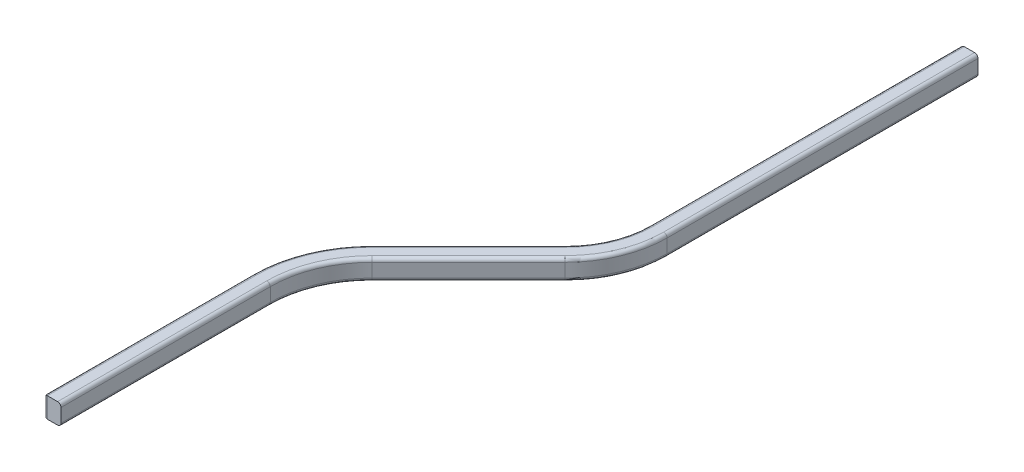
ISO-10303-21;
HEADER;
FILE_DESCRIPTION(('STEP AP214'),'2;1');
FILE_NAME('part.step','',(''),(''),'','','');
FILE_SCHEMA(('AUTOMOTIVE_DESIGN { 1 0 10303 214 1 1 1 1 }'));
ENDSEC;
DATA;
#1=APPLICATION_CONTEXT('core data for automotive mechanical design processes');
#2=APPLICATION_PROTOCOL_DEFINITION('international standard','automotive_design',2000,#1);
#3=PRODUCT_CONTEXT('',#1,'mechanical');
#4=PRODUCT('Part','Part','',(#3));
#5=PRODUCT_RELATED_PRODUCT_CATEGORY('part','',(#4));
#6=PRODUCT_DEFINITION_FORMATION('','',#4);
#7=PRODUCT_DEFINITION_CONTEXT('part definition',#1,'design');
#8=PRODUCT_DEFINITION('design','',#6,#7);
#9=PRODUCT_DEFINITION_SHAPE('','',#8);
#10=(LENGTH_UNIT() NAMED_UNIT(*) SI_UNIT(.MILLI.,.METRE.));
#11=(NAMED_UNIT(*) PLANE_ANGLE_UNIT() SI_UNIT($,.RADIAN.));
#12=(NAMED_UNIT(*) SI_UNIT($,.STERADIAN.) SOLID_ANGLE_UNIT());
#13=UNCERTAINTY_MEASURE_WITH_UNIT(LENGTH_MEASURE(1.E-05),#10,'distance_accuracy_value','');
#14=(GEOMETRIC_REPRESENTATION_CONTEXT(3) GLOBAL_UNCERTAINTY_ASSIGNED_CONTEXT((#13)) GLOBAL_UNIT_ASSIGNED_CONTEXT((#10,
#11,#12)) REPRESENTATION_CONTEXT('',''));
#15=CARTESIAN_POINT('',(0.,0.,0.));
#16=DIRECTION('',(0.,0.,1.));
#17=DIRECTION('',(1.,0.,0.));
#18=AXIS2_PLACEMENT_3D('',#15,#16,#17);
#19=CARTESIAN_POINT('',(34.6249999999996,6.,-121.171505340364));
#20=DIRECTION('',(0.,0.,1.));
#21=DIRECTION('',(1.,0.,0.));
#22=AXIS2_PLACEMENT_3D('',#19,#20,#21);
#23=PLANE('',#22);
#24=DIRECTION('',(-1.,0.,0.));
#25=VECTOR('',#24,1.);
#26=CARTESIAN_POINT('',(34.6249999999996,6.,-121.171505340364));
#27=LINE('',#26,#25);
#28=CARTESIAN_POINT('',(38.6249999999996,6.,-121.171505340364));
#29=VERTEX_POINT('',#28);
#30=CARTESIAN_POINT('',(35.6249999999996,6.,-121.171505340364));
#31=VERTEX_POINT('',#30);
#32=EDGE_CURVE('E222',#29,#31,#27,.T.);
#33=ORIENTED_EDGE('',*,*,#32,.F.);
#34=CARTESIAN_POINT('',(38.6249999999996,5.,-121.171505340364));
#35=DIRECTION('',(0.,0.,1.));
#36=DIRECTION('',(1.,0.,0.));
#37=AXIS2_PLACEMENT_3D('',#34,#35,#36);
#38=CIRCLE('',#37,1.);
#39=CARTESIAN_POINT('',(39.6249999999996,5.,-121.171505340364));
#40=VERTEX_POINT('',#39);
#41=EDGE_CURVE('E205',#29,#40,#38,.F.);
#42=ORIENTED_EDGE('',*,*,#41,.T.);
#43=DIRECTION('',(0.,-1.,0.));
#44=VECTOR('',#43,1.);
#45=CARTESIAN_POINT('',(39.6249999999996,6.,-121.171505340364));
#46=LINE('',#45,#44);
#47=CARTESIAN_POINT('',(39.6249999999996,1.,-121.171505340364));
#48=VERTEX_POINT('',#47);
#49=EDGE_CURVE('E236',#40,#48,#46,.T.);
#50=ORIENTED_EDGE('',*,*,#49,.T.);
#51=CARTESIAN_POINT('',(38.6249999999996,1.,-121.171505340364));
#52=DIRECTION('',(0.,0.,1.));
#53=DIRECTION('',(1.,0.,0.));
#54=AXIS2_PLACEMENT_3D('',#51,#52,#53);
#55=CIRCLE('',#54,1.);
#56=CARTESIAN_POINT('',(38.6249999999996,0.,-121.171505340364));
#57=VERTEX_POINT('',#56);
#58=EDGE_CURVE('E216',#48,#57,#55,.F.);
#59=ORIENTED_EDGE('',*,*,#58,.T.);
#60=DIRECTION('',(-1.,0.,0.));
#61=VECTOR('',#60,1.);
#62=CARTESIAN_POINT('',(34.6249999999996,0.,-121.171505340364));
#63=LINE('',#62,#61);
#64=CARTESIAN_POINT('',(35.6249999999996,0.,-121.171505340364));
#65=VERTEX_POINT('',#64);
#66=EDGE_CURVE('E239',#57,#65,#63,.T.);
#67=ORIENTED_EDGE('',*,*,#66,.T.);
#68=DIRECTION('',(0.,-1.,0.));
#69=VECTOR('',#68,1.);
#70=CARTESIAN_POINT('',(35.6249999999996,6.,-121.171505340364));
#71=LINE('',#70,#69);
#72=EDGE_CURVE('E231',#65,#31,#71,.F.);
#73=ORIENTED_EDGE('',*,*,#72,.T.);
#74=EDGE_LOOP('',(#33,#42,#50,#59,#67,#73));
#75=FACE_BOUND('',#74,.T.);
#76=ADVANCED_FACE('F43',(#75),#23,.F.);
#77=CARTESIAN_POINT('',(34.6249999999999,6.,-29.6402360015568));
#78=DIRECTION('',(1.,0.,0.));
#79=DIRECTION('',(0.,0.,-1.));
#80=AXIS2_PLACEMENT_3D('',#77,#78,#79);
#81=PLANE('',#80);
#82=DIRECTION('',(0.,-1.,0.));
#83=VECTOR('',#82,1.);
#84=CARTESIAN_POINT('',(34.6249999999999,6.,-29.6402360015568));
#85=LINE('',#84,#83);
#86=CARTESIAN_POINT('',(34.6249999999999,5.,-29.6402360015568));
#87=VERTEX_POINT('',#86);
#88=CARTESIAN_POINT('',(34.6249999999999,1.,-29.6402360015568));
#89=VERTEX_POINT('',#88);
#90=EDGE_CURVE('E268',#87,#89,#85,.T.);
#91=ORIENTED_EDGE('',*,*,#90,.F.);
#92=DIRECTION('',(0.,0.,1.));
#93=VECTOR('',#92,1.);
#94=CARTESIAN_POINT('',(34.6249999999999,5.,-29.6402360015568));
#95=LINE('',#94,#93);
#96=CARTESIAN_POINT('',(34.6249999999996,5.,-120.171505340364));
#97=VERTEX_POINT('',#96);
#98=EDGE_CURVE('E291',#87,#97,#95,.F.);
#99=ORIENTED_EDGE('',*,*,#98,.T.);
#100=DIRECTION('',(0.,-1.,0.));
#101=VECTOR('',#100,1.);
#102=CARTESIAN_POINT('',(34.6249999999996,6.,-120.171505340364));
#103=LINE('',#102,#101);
#104=CARTESIAN_POINT('',(34.6249999999996,1.,-120.171505340364));
#105=VERTEX_POINT('',#104);
#106=EDGE_CURVE('E287',#97,#105,#103,.T.);
#107=ORIENTED_EDGE('',*,*,#106,.T.);
#108=DIRECTION('',(0.,0.,1.));
#109=VECTOR('',#108,1.);
#110=CARTESIAN_POINT('',(34.6249999999999,1.,-29.6402360015568));
#111=LINE('',#110,#109);
#112=EDGE_CURVE('E289',#105,#89,#111,.T.);
#113=ORIENTED_EDGE('',*,*,#112,.T.);
#114=EDGE_LOOP('',(#91,#99,#107,#113));
#115=FACE_BOUND('',#114,.T.);
#116=ADVANCED_FACE('F466',(#115),#81,.F.);
#117=CARTESIAN_POINT('',(9.62499999999999,6.,-29.6402360015567));
#118=DIRECTION('',(0.,-1.,0.));
#119=DIRECTION('',(0.,0.,-1.));
#120=AXIS2_PLACEMENT_3D('',#117,#118,#119);
#121=CYLINDRICAL_SURFACE('',#120,24.9999999999999);
#122=DIRECTION('',(0.,-1.,0.));
#123=VECTOR('',#122,1.);
#124=CARTESIAN_POINT('',(27.3026695296636,6.,-11.962566471893));
#125=LINE('',#124,#123);
#126=CARTESIAN_POINT('',(27.3026695296636,5.,-11.962566471893));
#127=VERTEX_POINT('',#126);
#128=CARTESIAN_POINT('',(27.3026695296636,1.,-11.962566471893));
#129=VERTEX_POINT('',#128);
#130=EDGE_CURVE('E265',#127,#129,#125,.T.);
#131=ORIENTED_EDGE('',*,*,#130,.F.);
#132=CARTESIAN_POINT('',(9.62499999999999,5.,-29.6402360015567));
#133=DIRECTION('',(0.,-1.,0.));
#134=DIRECTION('',(0.,0.,-1.));
#135=AXIS2_PLACEMENT_3D('',#132,#133,#134);
#136=CIRCLE('',#135,24.9999999999999);
#137=EDGE_CURVE('E296',#127,#87,#136,.F.);
#138=ORIENTED_EDGE('',*,*,#137,.T.);
#139=ORIENTED_EDGE('',*,*,#90,.T.);
#140=CARTESIAN_POINT('',(9.62499999999999,1.,-29.6402360015567));
#141=DIRECTION('',(0.,-1.,0.));
#142=DIRECTION('',(0.,0.,-1.));
#143=AXIS2_PLACEMENT_3D('',#140,#141,#142);
#144=CIRCLE('',#143,24.9999999999999);
#145=EDGE_CURVE('E294',#89,#129,#144,.T.);
#146=ORIENTED_EDGE('',*,*,#145,.T.);
#147=EDGE_LOOP('',(#131,#138,#139,#146));
#148=FACE_BOUND('',#147,.T.);
#149=ADVANCED_FACE('F471',(#148),#121,.F.);
#150=CARTESIAN_POINT('',(-1.12373734152904,6.,16.4638403992997));
#151=DIRECTION('',(0.707106781186548,0.,0.707106781186547));
#152=DIRECTION('',(0.707106781186547,0.,-0.707106781186548));
#153=AXIS2_PLACEMENT_3D('',#150,#151,#152);
#154=PLANE('',#153);
#155=DIRECTION('',(0.,-1.,0.));
#156=VECTOR('',#155,1.);
#157=CARTESIAN_POINT('',(-1.12373734152904,6.,16.4638403992997));
#158=LINE('',#157,#156);
#159=CARTESIAN_POINT('',(-1.12373734152904,5.,16.4638403992997));
#160=VERTEX_POINT('',#159);
#161=CARTESIAN_POINT('',(-1.12373734152904,1.,16.4638403992997));
#162=VERTEX_POINT('',#161);
#163=EDGE_CURVE('E262',#160,#162,#158,.T.);
#164=ORIENTED_EDGE('',*,*,#163,.F.);
#165=DIRECTION('',(-0.707106781186547,0.,0.707106781186548));
#166=VECTOR('',#165,1.);
#167=CARTESIAN_POINT('',(-1.12373734152904,5.,16.4638403992997));
#168=LINE('',#167,#166);
#169=EDGE_CURVE('E300',#160,#127,#168,.F.);
#170=ORIENTED_EDGE('',*,*,#169,.T.);
#171=ORIENTED_EDGE('',*,*,#130,.T.);
#172=DIRECTION('',(-0.707106781186547,0.,0.707106781186548));
#173=VECTOR('',#172,1.);
#174=CARTESIAN_POINT('',(-1.12373734152904,1.,16.4638403992997));
#175=LINE('',#174,#173);
#176=EDGE_CURVE('E298',#129,#162,#175,.T.);
#177=ORIENTED_EDGE('',*,*,#176,.T.);
#178=EDGE_LOOP('',(#164,#170,#171,#177));
#179=FACE_BOUND('',#178,.T.);
#180=ADVANCED_FACE('F839',(#179),#154,.F.);
#181=CARTESIAN_POINT('',(23.625,6.,41.2125777408289));
#182=DIRECTION('',(0.,-1.,0.));
#183=DIRECTION('',(0.,0.,-1.));
#184=AXIS2_PLACEMENT_3D('',#181,#182,#183);
#185=CYLINDRICAL_SURFACE('',#184,35.);
#186=DIRECTION('',(0.,-1.,0.));
#187=VECTOR('',#186,1.);
#188=CARTESIAN_POINT('',(-11.375,6.,41.212577740829));
#189=LINE('',#188,#187);
#190=CARTESIAN_POINT('',(-11.375,5.,41.212577740829));
#191=VERTEX_POINT('',#190);
#192=CARTESIAN_POINT('',(-11.375,1.,41.212577740829));
#193=VERTEX_POINT('',#192);
#194=EDGE_CURVE('E260',#191,#193,#189,.T.);
#195=ORIENTED_EDGE('',*,*,#194,.F.);
#196=CARTESIAN_POINT('',(23.625,5.,41.2125777408289));
#197=DIRECTION('',(0.,-1.,0.));
#198=DIRECTION('',(0.,0.,-1.));
#199=AXIS2_PLACEMENT_3D('',#196,#197,#198);
#200=CIRCLE('',#199,35.);
#201=EDGE_CURVE('E304',#191,#160,#200,.T.);
#202=ORIENTED_EDGE('',*,*,#201,.T.);
#203=ORIENTED_EDGE('',*,*,#163,.T.);
#204=CARTESIAN_POINT('',(23.625,1.,41.2125777408289));
#205=DIRECTION('',(0.,-1.,0.));
#206=DIRECTION('',(0.,0.,-1.));
#207=AXIS2_PLACEMENT_3D('',#204,#205,#206);
#208=CIRCLE('',#207,35.);
#209=EDGE_CURVE('E302',#162,#193,#208,.F.);
#210=ORIENTED_EDGE('',*,*,#209,.T.);
#211=EDGE_LOOP('',(#195,#202,#203,#210));
#212=FACE_BOUND('',#211,.T.);
#213=ADVANCED_FACE('F439',(#212),#185,.T.);
#214=CARTESIAN_POINT('',(-11.3749999999998,6.,102.828494660829));
#215=DIRECTION('',(1.,0.,0.));
#216=DIRECTION('',(0.,0.,-1.));
#217=AXIS2_PLACEMENT_3D('',#214,#215,#216);
#218=PLANE('',#217);
#219=DIRECTION('',(0.,-1.,0.));
#220=VECTOR('',#219,1.);
#221=CARTESIAN_POINT('',(-11.3749999999998,6.,101.828494660829));
#222=LINE('',#221,#220);
#223=CARTESIAN_POINT('',(-11.3749999999998,1.,101.828494660829));
#224=VERTEX_POINT('',#223);
#225=CARTESIAN_POINT('',(-11.3749999999998,5.,101.828494660829));
#226=VERTEX_POINT('',#225);
#227=EDGE_CURVE('E60',#224,#226,#222,.F.);
#228=ORIENTED_EDGE('',*,*,#227,.T.);
#229=DIRECTION('',(0.,0.,1.));
#230=VECTOR('',#229,1.);
#231=CARTESIAN_POINT('',(-11.3749999999998,5.,102.828494660829));
#232=LINE('',#231,#230);
#233=EDGE_CURVE('E351',#226,#191,#232,.F.);
#234=ORIENTED_EDGE('',*,*,#233,.T.);
#235=ORIENTED_EDGE('',*,*,#194,.T.);
#236=DIRECTION('',(0.,0.,1.));
#237=VECTOR('',#236,1.);
#238=CARTESIAN_POINT('',(-11.3749999999998,1.,102.828494660829));
#239=LINE('',#238,#237);
#240=EDGE_CURVE('E65',#193,#224,#239,.T.);
#241=ORIENTED_EDGE('',*,*,#240,.T.);
#242=EDGE_LOOP('',(#228,#234,#235,#241));
#243=FACE_BOUND('',#242,.T.);
#244=ADVANCED_FACE('F437',(#243),#218,.F.);
#245=CARTESIAN_POINT('',(-6.37499999999976,6.,102.828494660829));
#246=DIRECTION('',(0.,0.,-1.));
#247=DIRECTION('',(-1.,0.,0.));
#248=AXIS2_PLACEMENT_3D('',#245,#246,#247);
#249=PLANE('',#248);
#250=DIRECTION('',(1.,0.,0.));
#251=VECTOR('',#250,1.);
#252=CARTESIAN_POINT('',(-6.37499999999976,6.,102.828494660829));
#253=LINE('',#252,#251);
#254=CARTESIAN_POINT('',(-10.3749999999998,6.,102.828494660829));
#255=VERTEX_POINT('',#254);
#256=CARTESIAN_POINT('',(-7.37499999999976,6.,102.828494660829));
#257=VERTEX_POINT('',#256);
#258=EDGE_CURVE('E232',#255,#257,#253,.T.);
#259=ORIENTED_EDGE('',*,*,#258,.F.);
#260=DIRECTION('',(0.,-1.,0.));
#261=VECTOR('',#260,1.);
#262=CARTESIAN_POINT('',(-10.3749999999998,6.,102.828494660829));
#263=LINE('',#262,#261);
#264=CARTESIAN_POINT('',(-10.3749999999998,0.,102.828494660829));
#265=VERTEX_POINT('',#264);
#266=EDGE_CURVE('E347',#255,#265,#263,.T.);
#267=ORIENTED_EDGE('',*,*,#266,.T.);
#268=DIRECTION('',(1.,0.,0.));
#269=VECTOR('',#268,1.);
#270=CARTESIAN_POINT('',(-6.37499999999976,0.,102.828494660829));
#271=LINE('',#270,#269);
#272=CARTESIAN_POINT('',(-7.37499999999976,0.,102.828494660829));
#273=VERTEX_POINT('',#272);
#274=EDGE_CURVE('E233',#265,#273,#271,.T.);
#275=ORIENTED_EDGE('',*,*,#274,.T.);
#276=CARTESIAN_POINT('',(-7.37499999999976,1.,102.828494660829));
#277=DIRECTION('',(0.,0.,-1.));
#278=DIRECTION('',(-1.,0.,0.));
#279=AXIS2_PLACEMENT_3D('',#276,#277,#278);
#280=CIRCLE('',#279,1.);
#281=CARTESIAN_POINT('',(-6.37499999999976,1.,102.828494660829));
#282=VERTEX_POINT('',#281);
#283=EDGE_CURVE('E343',#273,#282,#280,.F.);
#284=ORIENTED_EDGE('',*,*,#283,.T.);
#285=DIRECTION('',(0.,-1.,0.));
#286=VECTOR('',#285,1.);
#287=CARTESIAN_POINT('',(-6.37499999999976,6.,102.828494660829));
#288=LINE('',#287,#286);
#289=CARTESIAN_POINT('',(-6.37499999999976,5.,102.828494660829));
#290=VERTEX_POINT('',#289);
#291=EDGE_CURVE('E257',#290,#282,#288,.T.);
#292=ORIENTED_EDGE('',*,*,#291,.F.);
#293=CARTESIAN_POINT('',(-7.37499999999976,5.,102.828494660829));
#294=DIRECTION('',(0.,0.,-1.));
#295=DIRECTION('',(-1.,0.,0.));
#296=AXIS2_PLACEMENT_3D('',#293,#294,#295);
#297=CIRCLE('',#296,1.);
#298=EDGE_CURVE('E345',#290,#257,#297,.F.);
#299=ORIENTED_EDGE('',*,*,#298,.T.);
#300=EDGE_LOOP('',(#259,#267,#275,#284,#292,#299));
#301=FACE_BOUND('',#300,.T.);
#302=ADVANCED_FACE('F425',(#301),#249,.F.);
#303=CARTESIAN_POINT('',(-6.37499999999976,6.,102.828494660829));
#304=DIRECTION('',(-1.,0.,0.));
#305=DIRECTION('',(0.,0.,1.));
#306=AXIS2_PLACEMENT_3D('',#303,#304,#305);
#307=PLANE('',#306);
#308=DIRECTION('',(0.,-1.,0.));
#309=VECTOR('',#308,1.);
#310=CARTESIAN_POINT('',(-6.37499999999998,6.,41.212577740829));
#311=LINE('',#310,#309);
#312=CARTESIAN_POINT('',(-6.37499999999998,5.,41.212577740829));
#313=VERTEX_POINT('',#312);
#314=CARTESIAN_POINT('',(-6.37499999999998,1.,41.212577740829));
#315=VERTEX_POINT('',#314);
#316=EDGE_CURVE('E254',#313,#315,#311,.T.);
#317=ORIENTED_EDGE('',*,*,#316,.F.);
#318=DIRECTION('',(0.,0.,-1.));
#319=VECTOR('',#318,1.);
#320=CARTESIAN_POINT('',(-6.37499999999976,5.,102.828494660829));
#321=LINE('',#320,#319);
#322=EDGE_CURVE('E11',#313,#290,#321,.F.);
#323=ORIENTED_EDGE('',*,*,#322,.T.);
#324=ORIENTED_EDGE('',*,*,#291,.T.);
#325=DIRECTION('',(0.,0.,-1.));
#326=VECTOR('',#325,1.);
#327=CARTESIAN_POINT('',(-6.37499999999998,1.,41.212577740829));
#328=LINE('',#327,#326);
#329=EDGE_CURVE('E52',#282,#315,#328,.T.);
#330=ORIENTED_EDGE('',*,*,#329,.T.);
#331=EDGE_LOOP('',(#317,#323,#324,#330));
#332=FACE_BOUND('',#331,.T.);
#333=ADVANCED_FACE('F796',(#332),#307,.F.);
#334=CARTESIAN_POINT('',(23.625,6.,41.2125777408289));
#335=DIRECTION('',(0.,-1.,0.));
#336=DIRECTION('',(0.,0.,-1.));
#337=AXIS2_PLACEMENT_3D('',#334,#335,#336);
#338=CYLINDRICAL_SURFACE('',#337,30.);
#339=DIRECTION('',(0.,-1.,0.));
#340=VECTOR('',#339,1.);
#341=CARTESIAN_POINT('',(2.41179656440367,6.,19.9993743052324));
#342=LINE('',#341,#340);
#343=CARTESIAN_POINT('',(2.41179656440367,5.,19.9993743052324));
#344=VERTEX_POINT('',#343);
#345=CARTESIAN_POINT('',(2.41179656440367,1.,19.9993743052324));
#346=VERTEX_POINT('',#345);
#347=EDGE_CURVE('E251',#344,#346,#342,.T.);
#348=ORIENTED_EDGE('',*,*,#347,.F.);
#349=CARTESIAN_POINT('',(23.625,5.,41.2125777408289));
#350=DIRECTION('',(0.,-1.,0.));
#351=DIRECTION('',(0.,0.,-1.));
#352=AXIS2_PLACEMENT_3D('',#349,#350,#351);
#353=CIRCLE('',#352,30.);
#354=EDGE_CURVE('E341',#344,#313,#353,.F.);
#355=ORIENTED_EDGE('',*,*,#354,.T.);
#356=ORIENTED_EDGE('',*,*,#316,.T.);
#357=CARTESIAN_POINT('',(23.625,1.,41.2125777408289));
#358=DIRECTION('',(0.,-1.,0.));
#359=DIRECTION('',(0.,0.,-1.));
#360=AXIS2_PLACEMENT_3D('',#357,#358,#359);
#361=CIRCLE('',#360,30.);
#362=EDGE_CURVE('E339',#315,#346,#361,.T.);
#363=ORIENTED_EDGE('',*,*,#362,.T.);
#364=EDGE_LOOP('',(#348,#355,#356,#363));
#365=FACE_BOUND('',#364,.T.);
#366=ADVANCED_FACE('F784',(#365),#338,.F.);
#367=CARTESIAN_POINT('',(2.41179656440367,6.,19.9993743052324));
#368=DIRECTION('',(-0.707106781186548,0.,-0.707106781186548));
#369=DIRECTION('',(-0.707106781186548,0.,0.707106781186548));
#370=AXIS2_PLACEMENT_3D('',#367,#368,#369);
#371=PLANE('',#370);
#372=DIRECTION('',(0.,-1.,0.));
#373=VECTOR('',#372,1.);
#374=CARTESIAN_POINT('',(30.8382034355963,6.,-8.42703256596035));
#375=LINE('',#374,#373);
#376=CARTESIAN_POINT('',(30.8382034355963,5.,-8.42703256596035));
#377=VERTEX_POINT('',#376);
#378=CARTESIAN_POINT('',(30.8382034355963,1.,-8.42703256596035));
#379=VERTEX_POINT('',#378);
#380=EDGE_CURVE('E248',#377,#379,#375,.T.);
#381=ORIENTED_EDGE('',*,*,#380,.F.);
#382=DIRECTION('',(0.707106781186548,0.,-0.707106781186548));
#383=VECTOR('',#382,1.);
#384=CARTESIAN_POINT('',(2.41179656440367,5.,19.9993743052324));
#385=LINE('',#384,#383);
#386=EDGE_CURVE('E337',#377,#344,#385,.F.);
#387=ORIENTED_EDGE('',*,*,#386,.T.);
#388=ORIENTED_EDGE('',*,*,#347,.T.);
#389=DIRECTION('',(0.707106781186548,0.,-0.707106781186548));
#390=VECTOR('',#389,1.);
#391=CARTESIAN_POINT('',(30.8382034355964,1.,-8.42703256596031));
#392=LINE('',#391,#390);
#393=EDGE_CURVE('E335',#346,#379,#392,.T.);
#394=ORIENTED_EDGE('',*,*,#393,.T.);
#395=EDGE_LOOP('',(#381,#387,#388,#394));
#396=FACE_BOUND('',#395,.T.);
#397=ADVANCED_FACE('F772',(#396),#371,.F.);
#398=CARTESIAN_POINT('',(9.62500000000004,6.,-29.6402360015568));
#399=DIRECTION('',(0.,-1.,0.));
#400=DIRECTION('',(0.,0.,-1.));
#401=AXIS2_PLACEMENT_3D('',#398,#399,#400);
#402=CYLINDRICAL_SURFACE('',#401,30.);
#403=DIRECTION('',(0.,-1.,0.));
#404=VECTOR('',#403,1.);
#405=CARTESIAN_POINT('',(39.6249999999999,6.,-29.6402360015568));
#406=LINE('',#405,#404);
#407=CARTESIAN_POINT('',(39.6249999999999,5.,-29.6402360015568));
#408=VERTEX_POINT('',#407);
#409=CARTESIAN_POINT('',(39.6249999999999,1.,-29.6402360015568));
#410=VERTEX_POINT('',#409);
#411=EDGE_CURVE('E245',#408,#410,#406,.T.);
#412=ORIENTED_EDGE('',*,*,#411,.F.);
#413=CARTESIAN_POINT('',(9.62500000000004,5.,-29.6402360015568));
#414=DIRECTION('',(0.,-1.,0.));
#415=DIRECTION('',(0.,0.,-1.));
#416=AXIS2_PLACEMENT_3D('',#413,#414,#415);
#417=CIRCLE('',#416,30.);
#418=EDGE_CURVE('E333',#408,#377,#417,.T.);
#419=ORIENTED_EDGE('',*,*,#418,.T.);
#420=ORIENTED_EDGE('',*,*,#380,.T.);
#421=CARTESIAN_POINT('',(9.62500000000004,1.,-29.6402360015568));
#422=DIRECTION('',(0.,-1.,0.));
#423=DIRECTION('',(0.,0.,-1.));
#424=AXIS2_PLACEMENT_3D('',#421,#422,#423);
#425=CIRCLE('',#424,30.);
#426=EDGE_CURVE('E331',#379,#410,#425,.F.);
#427=ORIENTED_EDGE('',*,*,#426,.T.);
#428=EDGE_LOOP('',(#412,#419,#420,#427));
#429=FACE_BOUND('',#428,.T.);
#430=ADVANCED_FACE('F760',(#429),#402,.T.);
#431=CARTESIAN_POINT('',(39.6249999999999,6.,-29.6402360015568));
#432=DIRECTION('',(-1.,0.,0.));
#433=DIRECTION('',(0.,0.,1.));
#434=AXIS2_PLACEMENT_3D('',#431,#432,#433);
#435=PLANE('',#434);
#436=ORIENTED_EDGE('',*,*,#49,.F.);
#437=DIRECTION('',(0.,0.,-1.));
#438=VECTOR('',#437,1.);
#439=CARTESIAN_POINT('',(39.6249999999999,5.,-29.6402360015568));
#440=LINE('',#439,#438);
#441=EDGE_CURVE('E210',#40,#408,#440,.F.);
#442=ORIENTED_EDGE('',*,*,#441,.T.);
#443=ORIENTED_EDGE('',*,*,#411,.T.);
#444=DIRECTION('',(0.,0.,-1.));
#445=VECTOR('',#444,1.);
#446=CARTESIAN_POINT('',(39.6249999999996,1.,-121.171505340364));
#447=LINE('',#446,#445);
#448=EDGE_CURVE('E215',#410,#48,#447,.T.);
#449=ORIENTED_EDGE('',*,*,#448,.T.);
#450=EDGE_LOOP('',(#436,#442,#443,#449));
#451=FACE_BOUND('',#450,.T.);
#452=ADVANCED_FACE('F749',(#451),#435,.F.);
#453=CARTESIAN_POINT('',(9.62500000000004,6.,-29.6402360015568));
#454=DIRECTION('',(0.,-1.,0.));
#455=DIRECTION('',(0.,0.,-1.));
#456=AXIS2_PLACEMENT_3D('',#453,#454,#455);
#457=PLANE('',#456);
#458=ORIENTED_EDGE('',*,*,#32,.T.);
#459=DIRECTION('',(0.,0.,1.));
#460=VECTOR('',#459,1.);
#461=CARTESIAN_POINT('',(35.6249999999999,6.,-29.6402360015569));
#462=LINE('',#461,#460);
#463=CARTESIAN_POINT('',(35.6249999999999,6.,-29.6402360015568));
#464=VERTEX_POINT('',#463);
#465=EDGE_CURVE('E285',#31,#464,#462,.T.);
#466=ORIENTED_EDGE('',*,*,#465,.T.);
#467=CARTESIAN_POINT('',(9.62499999999999,6.,-29.6402360015567));
#468=DIRECTION('',(0.,-1.,0.));
#469=DIRECTION('',(0.,0.,-1.));
#470=AXIS2_PLACEMENT_3D('',#467,#468,#469);
#471=CIRCLE('',#470,25.9999999999999);
#472=CARTESIAN_POINT('',(28.0097763108502,6.,-11.2554596907065));
#473=VERTEX_POINT('',#472);
#474=EDGE_CURVE('E283',#464,#473,#471,.T.);
#475=ORIENTED_EDGE('',*,*,#474,.T.);
#476=DIRECTION('',(-0.707106781186547,0.,0.707106781186548));
#477=VECTOR('',#476,1.);
#478=CARTESIAN_POINT('',(28.0097763108503,6.,-11.2554596907066));
#479=LINE('',#478,#477);
#480=CARTESIAN_POINT('',(-0.416630560342491,6.,17.1709471804862));
#481=VERTEX_POINT('',#480);
#482=EDGE_CURVE('E281',#473,#481,#479,.T.);
#483=ORIENTED_EDGE('',*,*,#482,.T.);
#484=CARTESIAN_POINT('',(23.625,6.,41.2125777408289));
#485=DIRECTION('',(0.,-1.,0.));
#486=DIRECTION('',(0.,0.,-1.));
#487=AXIS2_PLACEMENT_3D('',#484,#485,#486);
#488=CIRCLE('',#487,34.);
#489=CARTESIAN_POINT('',(-10.375,6.,41.212577740829));
#490=VERTEX_POINT('',#489);
#491=EDGE_CURVE('E279',#481,#490,#488,.F.);
#492=ORIENTED_EDGE('',*,*,#491,.T.);
#493=DIRECTION('',(0.,0.,1.));
#494=VECTOR('',#493,1.);
#495=CARTESIAN_POINT('',(-10.3750000000002,6.,-29.6402360015567));
#496=LINE('',#495,#494);
#497=EDGE_CURVE('E227',#490,#255,#496,.T.);
#498=ORIENTED_EDGE('',*,*,#497,.T.);
#499=ORIENTED_EDGE('',*,*,#258,.T.);
#500=DIRECTION('',(0.,0.,-1.));
#501=VECTOR('',#500,1.);
#502=CARTESIAN_POINT('',(-7.37500000000025,6.,-29.6402360015568));
#503=LINE('',#502,#501);
#504=CARTESIAN_POINT('',(-7.37499999999998,6.,41.212577740829));
#505=VERTEX_POINT('',#504);
#506=EDGE_CURVE('E271',#257,#505,#503,.T.);
#507=ORIENTED_EDGE('',*,*,#506,.T.);
#508=CARTESIAN_POINT('',(23.625,6.,41.2125777408289));
#509=DIRECTION('',(0.,-1.,0.));
#510=DIRECTION('',(0.,0.,-1.));
#511=AXIS2_PLACEMENT_3D('',#508,#509,#510);
#512=CIRCLE('',#511,31.);
#513=CARTESIAN_POINT('',(1.70468978321712,6.,19.2922675240459));
#514=VERTEX_POINT('',#513);
#515=EDGE_CURVE('E273',#505,#514,#512,.T.);
#516=ORIENTED_EDGE('',*,*,#515,.T.);
#517=DIRECTION('',(0.707106781186548,0.,-0.707106781186548));
#518=VECTOR('',#517,1.);
#519=CARTESIAN_POINT('',(30.1310966544099,6.,-9.13413934714694));
#520=LINE('',#519,#518);
#521=CARTESIAN_POINT('',(30.1310966544098,6.,-9.13413934714686));
#522=VERTEX_POINT('',#521);
#523=EDGE_CURVE('E275',#514,#522,#520,.T.);
#524=ORIENTED_EDGE('',*,*,#523,.T.);
#525=CARTESIAN_POINT('',(9.62500000000004,6.,-29.6402360015568));
#526=DIRECTION('',(0.,-1.,0.));
#527=DIRECTION('',(0.,0.,-1.));
#528=AXIS2_PLACEMENT_3D('',#525,#526,#527);
#529=CIRCLE('',#528,29.);
#530=CARTESIAN_POINT('',(38.625,6.,-29.6402360015568));
#531=VERTEX_POINT('',#530);
#532=EDGE_CURVE('E225',#522,#531,#529,.F.);
#533=ORIENTED_EDGE('',*,*,#532,.T.);
#534=DIRECTION('',(0.,0.,-1.));
#535=VECTOR('',#534,1.);
#536=CARTESIAN_POINT('',(38.6249999999999,6.,-29.6402360015569));
#537=LINE('',#536,#535);
#538=EDGE_CURVE('E209',#531,#29,#537,.T.);
#539=ORIENTED_EDGE('',*,*,#538,.T.);
#540=EDGE_LOOP('',(#458,#466,#475,#483,#492,#498,#499,#507,#516,#524,#533,#539));
#541=FACE_BOUND('',#540,.T.);
#542=ADVANCED_FACE('F220',(#541),#457,.F.);
#543=CARTESIAN_POINT('',(9.62500000000004,0.,-29.6402360015568));
#544=DIRECTION('',(0.,-1.,0.));
#545=DIRECTION('',(0.,0.,-1.));
#546=AXIS2_PLACEMENT_3D('',#543,#544,#545);
#547=PLANE('',#546);
#548=CARTESIAN_POINT('',(9.62499999999999,0.,-29.6402360015567));
#549=DIRECTION('',(0.,-1.,0.));
#550=DIRECTION('',(0.,0.,-1.));
#551=AXIS2_PLACEMENT_3D('',#548,#549,#550);
#552=CIRCLE('',#551,25.9999999999999);
#553=CARTESIAN_POINT('',(28.0097763108502,0.,-11.2554596907065));
#554=VERTEX_POINT('',#553);
#555=CARTESIAN_POINT('',(35.6249999999999,0.,-29.6402360015568));
#556=VERTEX_POINT('',#555);
#557=EDGE_CURVE('E322',#554,#556,#552,.F.);
#558=ORIENTED_EDGE('',*,*,#557,.T.);
#559=DIRECTION('',(0.,0.,1.));
#560=VECTOR('',#559,1.);
#561=CARTESIAN_POINT('',(35.6249999999996,0.,-121.171505340364));
#562=LINE('',#561,#560);
#563=EDGE_CURVE('E324',#556,#65,#562,.F.);
#564=ORIENTED_EDGE('',*,*,#563,.T.);
#565=ORIENTED_EDGE('',*,*,#66,.F.);
#566=DIRECTION('',(0.,0.,-1.));
#567=VECTOR('',#566,1.);
#568=CARTESIAN_POINT('',(38.6249999999999,0.,-29.6402360015568));
#569=LINE('',#568,#567);
#570=CARTESIAN_POINT('',(38.625,0.,-29.6402360015568));
#571=VERTEX_POINT('',#570);
#572=EDGE_CURVE('E314',#57,#571,#569,.F.);
#573=ORIENTED_EDGE('',*,*,#572,.T.);
#574=CARTESIAN_POINT('',(9.62500000000004,0.,-29.6402360015568));
#575=DIRECTION('',(0.,-1.,0.));
#576=DIRECTION('',(0.,0.,-1.));
#577=AXIS2_PLACEMENT_3D('',#574,#575,#576);
#578=CIRCLE('',#577,29.);
#579=CARTESIAN_POINT('',(30.1310966544098,0.,-9.13413934714685));
#580=VERTEX_POINT('',#579);
#581=EDGE_CURVE('E312',#571,#580,#578,.T.);
#582=ORIENTED_EDGE('',*,*,#581,.T.);
#583=DIRECTION('',(0.707106781186548,0.,-0.707106781186548));
#584=VECTOR('',#583,1.);
#585=CARTESIAN_POINT('',(1.70468978321712,0.,19.2922675240459));
#586=LINE('',#585,#584);
#587=CARTESIAN_POINT('',(1.70468978321712,0.,19.2922675240459));
#588=VERTEX_POINT('',#587);
#589=EDGE_CURVE('E310',#580,#588,#586,.F.);
#590=ORIENTED_EDGE('',*,*,#589,.T.);
#591=CARTESIAN_POINT('',(23.625,0.,41.2125777408289));
#592=DIRECTION('',(0.,-1.,0.));
#593=DIRECTION('',(0.,0.,-1.));
#594=AXIS2_PLACEMENT_3D('',#591,#592,#593);
#595=CIRCLE('',#594,31.);
#596=CARTESIAN_POINT('',(-7.37499999999998,0.,41.212577740829));
#597=VERTEX_POINT('',#596);
#598=EDGE_CURVE('E308',#588,#597,#595,.F.);
#599=ORIENTED_EDGE('',*,*,#598,.T.);
#600=DIRECTION('',(0.,0.,-1.));
#601=VECTOR('',#600,1.);
#602=CARTESIAN_POINT('',(-7.37499999999976,0.,102.828494660829));
#603=LINE('',#602,#601);
#604=EDGE_CURVE('E306',#597,#273,#603,.F.);
#605=ORIENTED_EDGE('',*,*,#604,.T.);
#606=ORIENTED_EDGE('',*,*,#274,.F.);
#607=DIRECTION('',(0.,0.,1.));
#608=VECTOR('',#607,1.);
#609=CARTESIAN_POINT('',(-10.375,0.,41.212577740829));
#610=LINE('',#609,#608);
#611=CARTESIAN_POINT('',(-10.375,0.,41.212577740829));
#612=VERTEX_POINT('',#611);
#613=EDGE_CURVE('E316',#265,#612,#610,.F.);
#614=ORIENTED_EDGE('',*,*,#613,.T.);
#615=CARTESIAN_POINT('',(23.625,0.,41.2125777408289));
#616=DIRECTION('',(0.,-1.,0.));
#617=DIRECTION('',(0.,0.,-1.));
#618=AXIS2_PLACEMENT_3D('',#615,#616,#617);
#619=CIRCLE('',#618,34.);
#620=CARTESIAN_POINT('',(-0.416630560342493,0.,17.1709471804862));
#621=VERTEX_POINT('',#620);
#622=EDGE_CURVE('E318',#612,#621,#619,.T.);
#623=ORIENTED_EDGE('',*,*,#622,.T.);
#624=DIRECTION('',(-0.707106781186547,0.,0.707106781186548));
#625=VECTOR('',#624,1.);
#626=CARTESIAN_POINT('',(28.0097763108502,0.,-11.2554596907065));
#627=LINE('',#626,#625);
#628=EDGE_CURVE('E320',#621,#554,#627,.F.);
#629=ORIENTED_EDGE('',*,*,#628,.T.);
#630=EDGE_LOOP('',(#558,#564,#565,#573,#582,#590,#599,#605,#606,#614,#623,#629));
#631=FACE_BOUND('',#630,.T.);
#632=ADVANCED_FACE('F421',(#631),#547,.T.);
#633=CARTESIAN_POINT('',(-10.3749999999998,1.,102.828494660829));
#634=DIRECTION('',(0.,0.,-1.));
#635=DIRECTION('',(-1.,0.,0.));
#636=AXIS2_PLACEMENT_3D('',#633,#634,#635);
#637=CYLINDRICAL_SURFACE('',#636,1.);
#638=CARTESIAN_POINT('',(-10.3749999999998,1.,101.828494660829));
#639=DIRECTION('',(0.,-0.707106781186547,-0.707106781186547));
#640=DIRECTION('',(0.,0.707106781186547,-0.707106781186547));
#641=AXIS2_PLACEMENT_3D('',#638,#639,#640);
#642=ELLIPSE('',#641,1.41421356237309,1.);
#643=EDGE_CURVE('E383',#224,#265,#642,.F.);
#644=ORIENTED_EDGE('',*,*,#643,.F.);
#645=ORIENTED_EDGE('',*,*,#240,.F.);
#646=CARTESIAN_POINT('',(-10.375,1.,41.212577740829));
#647=DIRECTION('',(0.,0.,-1.));
#648=DIRECTION('',(-1.,0.,0.));
#649=AXIS2_PLACEMENT_3D('',#646,#647,#648);
#650=CIRCLE('',#649,1.);
#651=EDGE_CURVE('E242',#612,#193,#650,.T.);
#652=ORIENTED_EDGE('',*,*,#651,.F.);
#653=ORIENTED_EDGE('',*,*,#613,.F.);
#654=EDGE_LOOP('',(#644,#645,#652,#653));
#655=FACE_BOUND('',#654,.T.);
#656=ADVANCED_FACE('F455',(#655),#637,.T.);
#657=CARTESIAN_POINT('',(23.625,1.,41.2125777408289));
#658=DIRECTION('',(0.,-1.,0.));
#659=DIRECTION('',(0.,0.,-1.));
#660=AXIS2_PLACEMENT_3D('',#657,#658,#659);
#661=TOROIDAL_SURFACE('',#660,34.,1.);
#662=ORIENTED_EDGE('',*,*,#651,.T.);
#663=ORIENTED_EDGE('',*,*,#209,.F.);
#664=CARTESIAN_POINT('',(-0.416630560342493,1.,17.1709471804862));
#665=DIRECTION('',(0.707106781186548,0.,-0.707106781186547));
#666=DIRECTION('',(-0.707106781186547,0.,-0.707106781186548));
#667=AXIS2_PLACEMENT_3D('',#664,#665,#666);
#668=CIRCLE('',#667,1.);
#669=EDGE_CURVE('E380',#621,#162,#668,.T.);
#670=ORIENTED_EDGE('',*,*,#669,.F.);
#671=ORIENTED_EDGE('',*,*,#622,.F.);
#672=EDGE_LOOP('',(#662,#663,#670,#671));
#673=FACE_BOUND('',#672,.T.);
#674=ADVANCED_FACE('F444',(#673),#661,.T.);
#675=CARTESIAN_POINT('',(-10.3749999999998,6.,101.828494660829));
#676=DIRECTION('',(0.,-1.,0.));
#677=DIRECTION('',(0.,0.,-1.));
#678=AXIS2_PLACEMENT_3D('',#675,#676,#677);
#679=CYLINDRICAL_SURFACE('',#678,1.);
#680=ORIENTED_EDGE('',*,*,#643,.T.);
#681=ORIENTED_EDGE('',*,*,#266,.F.);
#682=CARTESIAN_POINT('',(-10.3749999999998,5.,101.828494660829));
#683=DIRECTION('',(0.,-0.707106781186547,0.707106781186547));
#684=DIRECTION('',(0.,0.707106781186547,0.707106781186547));
#685=AXIS2_PLACEMENT_3D('',#682,#683,#684);
#686=ELLIPSE('',#685,1.41421356237309,1.);
#687=EDGE_CURVE('E377',#226,#255,#686,.F.);
#688=ORIENTED_EDGE('',*,*,#687,.F.);
#689=ORIENTED_EDGE('',*,*,#227,.F.);
#690=EDGE_LOOP('',(#680,#681,#688,#689));
#691=FACE_BOUND('',#690,.T.);
#692=ADVANCED_FACE('F429',(#691),#679,.T.);
#693=CARTESIAN_POINT('',(-0.416630560342497,1.,17.1709471804862));
#694=DIRECTION('',(0.707106781186547,0.,-0.707106781186548));
#695=DIRECTION('',(-0.707106781186548,0.,-0.707106781186547));
#696=AXIS2_PLACEMENT_3D('',#693,#694,#695);
#697=CYLINDRICAL_SURFACE('',#696,1.);
#698=ORIENTED_EDGE('',*,*,#669,.T.);
#699=ORIENTED_EDGE('',*,*,#176,.F.);
#700=CARTESIAN_POINT('',(28.0097763108502,1.,-11.2554596907065));
#701=DIRECTION('',(0.707106781186546,0.,-0.707106781186549));
#702=DIRECTION('',(-0.707106781186549,0.,-0.707106781186546));
#703=AXIS2_PLACEMENT_3D('',#700,#701,#702);
#704=CIRCLE('',#703,1.);
#705=EDGE_CURVE('E374',#554,#129,#704,.T.);
#706=ORIENTED_EDGE('',*,*,#705,.F.);
#707=ORIENTED_EDGE('',*,*,#628,.F.);
#708=EDGE_LOOP('',(#698,#699,#706,#707));
#709=FACE_BOUND('',#708,.T.);
#710=ADVANCED_FACE('F450',(#709),#697,.T.);
#711=CARTESIAN_POINT('',(-10.3750000000002,5.,-29.6402360015567));
#712=DIRECTION('',(0.,0.,1.));
#713=DIRECTION('',(1.,0.,0.));
#714=AXIS2_PLACEMENT_3D('',#711,#712,#713);
#715=CYLINDRICAL_SURFACE('',#714,1.);
#716=ORIENTED_EDGE('',*,*,#687,.T.);
#717=ORIENTED_EDGE('',*,*,#497,.F.);
#718=CARTESIAN_POINT('',(-10.375,5.,41.212577740829));
#719=DIRECTION('',(0.,0.,-1.));
#720=DIRECTION('',(-1.,0.,0.));
#721=AXIS2_PLACEMENT_3D('',#718,#719,#720);
#722=CIRCLE('',#721,1.);
#723=EDGE_CURVE('E371',#191,#490,#722,.T.);
#724=ORIENTED_EDGE('',*,*,#723,.F.);
#725=ORIENTED_EDGE('',*,*,#233,.F.);
#726=EDGE_LOOP('',(#716,#717,#724,#725));
#727=FACE_BOUND('',#726,.T.);
#728=ADVANCED_FACE('F433',(#727),#715,.T.);
#729=CARTESIAN_POINT('',(9.62499999999999,1.,-29.6402360015567));
#730=DIRECTION('',(0.,-1.,0.));
#731=DIRECTION('',(0.,0.,-1.));
#732=AXIS2_PLACEMENT_3D('',#729,#730,#731);
#733=TOROIDAL_SURFACE('',#732,25.9999999999999,1.);
#734=ORIENTED_EDGE('',*,*,#705,.T.);
#735=ORIENTED_EDGE('',*,*,#145,.F.);
#736=CARTESIAN_POINT('',(35.6249999999999,1.,-29.6402360015568));
#737=DIRECTION('',(0.,0.,-1.));
#738=DIRECTION('',(-1.,0.,0.));
#739=AXIS2_PLACEMENT_3D('',#736,#737,#738);
#740=CIRCLE('',#739,1.);
#741=EDGE_CURVE('E368',#556,#89,#740,.T.);
#742=ORIENTED_EDGE('',*,*,#741,.F.);
#743=ORIENTED_EDGE('',*,*,#557,.F.);
#744=EDGE_LOOP('',(#734,#735,#742,#743));
#745=FACE_BOUND('',#744,.T.);
#746=ADVANCED_FACE('F500',(#745),#733,.T.);
#747=CARTESIAN_POINT('',(23.625,5.,41.2125777408289));
#748=DIRECTION('',(0.,-1.,0.));
#749=DIRECTION('',(0.,0.,-1.));
#750=AXIS2_PLACEMENT_3D('',#747,#748,#749);
#751=TOROIDAL_SURFACE('',#750,34.,1.);
#752=ORIENTED_EDGE('',*,*,#723,.T.);
#753=ORIENTED_EDGE('',*,*,#491,.F.);
#754=CARTESIAN_POINT('',(-0.416630560342496,5.,17.1709471804862));
#755=DIRECTION('',(0.707106781186551,0.,-0.707106781186544));
#756=DIRECTION('',(-0.707106781186544,0.,-0.707106781186551));
#757=AXIS2_PLACEMENT_3D('',#754,#755,#756);
#758=CIRCLE('',#757,1.);
#759=EDGE_CURVE('E365',#160,#481,#758,.T.);
#760=ORIENTED_EDGE('',*,*,#759,.F.);
#761=ORIENTED_EDGE('',*,*,#201,.F.);
#762=EDGE_LOOP('',(#752,#753,#760,#761));
#763=FACE_BOUND('',#762,.T.);
#764=ADVANCED_FACE('F496',(#763),#751,.T.);
#765=CARTESIAN_POINT('',(35.6249999999999,1.,-29.6402360015568));
#766=DIRECTION('',(0.,0.,-1.));
#767=DIRECTION('',(-1.,0.,0.));
#768=AXIS2_PLACEMENT_3D('',#765,#766,#767);
#769=CYLINDRICAL_SURFACE('',#768,1.);
#770=ORIENTED_EDGE('',*,*,#741,.T.);
#771=ORIENTED_EDGE('',*,*,#112,.F.);
#772=CARTESIAN_POINT('',(35.6249999999996,1.,-120.171505340364));
#773=DIRECTION('',(0.,-0.707106781186547,0.707106781186547));
#774=DIRECTION('',(0.,-0.707106781186547,-0.707106781186547));
#775=AXIS2_PLACEMENT_3D('',#772,#773,#774);
#776=ELLIPSE('',#775,1.41421356237309,1.);
#777=EDGE_CURVE('E362',#65,#105,#776,.F.);
#778=ORIENTED_EDGE('',*,*,#777,.F.);
#779=ORIENTED_EDGE('',*,*,#563,.F.);
#780=EDGE_LOOP('',(#770,#771,#778,#779));
#781=FACE_BOUND('',#780,.T.);
#782=ADVANCED_FACE('F492',(#781),#769,.T.);
#783=CARTESIAN_POINT('',(28.0097763108503,5.,-11.2554596907066));
#784=DIRECTION('',(-0.707106781186547,0.,0.707106781186548));
#785=DIRECTION('',(0.707106781186548,0.,0.707106781186547));
#786=AXIS2_PLACEMENT_3D('',#783,#784,#785);
#787=CYLINDRICAL_SURFACE('',#786,1.);
#788=ORIENTED_EDGE('',*,*,#759,.T.);
#789=ORIENTED_EDGE('',*,*,#482,.F.);
#790=CARTESIAN_POINT('',(28.0097763108502,5.,-11.2554596907065));
#791=DIRECTION('',(0.707106781186547,0.,-0.707106781186548));
#792=DIRECTION('',(-0.707106781186548,0.,-0.707106781186547));
#793=AXIS2_PLACEMENT_3D('',#790,#791,#792);
#794=CIRCLE('',#793,1.);
#795=EDGE_CURVE('E359',#127,#473,#794,.T.);
#796=ORIENTED_EDGE('',*,*,#795,.F.);
#797=ORIENTED_EDGE('',*,*,#169,.F.);
#798=EDGE_LOOP('',(#788,#789,#796,#797));
#799=FACE_BOUND('',#798,.T.);
#800=ADVANCED_FACE('F488',(#799),#787,.T.);
#801=CARTESIAN_POINT('',(35.6249999999996,6.,-120.171505340364));
#802=DIRECTION('',(0.,-1.,0.));
#803=DIRECTION('',(0.,0.,-1.));
#804=AXIS2_PLACEMENT_3D('',#801,#802,#803);
#805=CYLINDRICAL_SURFACE('',#804,1.);
#806=ORIENTED_EDGE('',*,*,#777,.T.);
#807=ORIENTED_EDGE('',*,*,#106,.F.);
#808=CARTESIAN_POINT('',(35.6249999999996,5.,-120.171505340364));
#809=DIRECTION('',(0.,-0.707106781186547,-0.707106781186547));
#810=DIRECTION('',(0.,-0.707106781186547,0.707106781186547));
#811=AXIS2_PLACEMENT_3D('',#808,#809,#810);
#812=ELLIPSE('',#811,1.41421356237309,1.);
#813=EDGE_CURVE('E356',#31,#97,#812,.F.);
#814=ORIENTED_EDGE('',*,*,#813,.F.);
#815=ORIENTED_EDGE('',*,*,#72,.F.);
#816=EDGE_LOOP('',(#806,#807,#814,#815));
#817=FACE_BOUND('',#816,.T.);
#818=ADVANCED_FACE('F484',(#817),#805,.T.);
#819=CARTESIAN_POINT('',(9.62499999999999,5.,-29.6402360015567));
#820=DIRECTION('',(0.,-1.,0.));
#821=DIRECTION('',(0.,0.,-1.));
#822=AXIS2_PLACEMENT_3D('',#819,#820,#821);
#823=TOROIDAL_SURFACE('',#822,25.9999999999999,1.);
#824=ORIENTED_EDGE('',*,*,#795,.T.);
#825=ORIENTED_EDGE('',*,*,#474,.F.);
#826=CARTESIAN_POINT('',(35.6249999999999,5.,-29.6402360015568));
#827=DIRECTION('',(0.,0.,-1.));
#828=DIRECTION('',(-1.,0.,0.));
#829=AXIS2_PLACEMENT_3D('',#826,#827,#828);
#830=CIRCLE('',#829,1.);
#831=EDGE_CURVE('E354',#87,#464,#830,.T.);
#832=ORIENTED_EDGE('',*,*,#831,.F.);
#833=ORIENTED_EDGE('',*,*,#137,.F.);
#834=EDGE_LOOP('',(#824,#825,#832,#833));
#835=FACE_BOUND('',#834,.T.);
#836=ADVANCED_FACE('F480',(#835),#823,.T.);
#837=CARTESIAN_POINT('',(35.6249999999999,5.,-29.6402360015569));
#838=DIRECTION('',(0.,0.,1.));
#839=DIRECTION('',(1.,0.,0.));
#840=AXIS2_PLACEMENT_3D('',#837,#838,#839);
#841=CYLINDRICAL_SURFACE('',#840,1.);
#842=ORIENTED_EDGE('',*,*,#813,.T.);
#843=ORIENTED_EDGE('',*,*,#98,.F.);
#844=ORIENTED_EDGE('',*,*,#831,.T.);
#845=ORIENTED_EDGE('',*,*,#465,.F.);
#846=EDGE_LOOP('',(#842,#843,#844,#845));
#847=FACE_BOUND('',#846,.T.);
#848=ADVANCED_FACE('F476',(#847),#841,.T.);
#849=CARTESIAN_POINT('',(-7.37500000000025,5.,-29.6402360015568));
#850=DIRECTION('',(0.,0.,-1.));
#851=DIRECTION('',(-1.,0.,0.));
#852=AXIS2_PLACEMENT_3D('',#849,#850,#851);
#853=CYLINDRICAL_SURFACE('',#852,1.);
#854=ORIENTED_EDGE('',*,*,#298,.F.);
#855=ORIENTED_EDGE('',*,*,#322,.F.);
#856=CARTESIAN_POINT('',(-7.37499999999998,5.,41.212577740829));
#857=DIRECTION('',(0.,0.,-1.));
#858=DIRECTION('',(-1.,0.,0.));
#859=AXIS2_PLACEMENT_3D('',#856,#857,#858);
#860=CIRCLE('',#859,1.);
#861=EDGE_CURVE('E357',#505,#313,#860,.T.);
#862=ORIENTED_EDGE('',*,*,#861,.F.);
#863=ORIENTED_EDGE('',*,*,#506,.F.);
#864=EDGE_LOOP('',(#854,#855,#862,#863));
#865=FACE_BOUND('',#864,.T.);
#866=ADVANCED_FACE('F479',(#865),#853,.T.);
#867=CARTESIAN_POINT('',(23.625,5.,41.2125777408289));
#868=DIRECTION('',(0.,-1.,0.));
#869=DIRECTION('',(0.,0.,-1.));
#870=AXIS2_PLACEMENT_3D('',#867,#868,#869);
#871=TOROIDAL_SURFACE('',#870,31.,1.);
#872=ORIENTED_EDGE('',*,*,#861,.T.);
#873=ORIENTED_EDGE('',*,*,#354,.F.);
#874=CARTESIAN_POINT('',(1.70468978321712,5.,19.2922675240459));
#875=DIRECTION('',(0.707106781186548,0.,-0.707106781186547));
#876=DIRECTION('',(-0.707106781186547,0.,-0.707106781186548));
#877=AXIS2_PLACEMENT_3D('',#874,#875,#876);
#878=CIRCLE('',#877,1.);
#879=EDGE_CURVE('E393',#514,#344,#878,.T.);
#880=ORIENTED_EDGE('',*,*,#879,.F.);
#881=ORIENTED_EDGE('',*,*,#515,.F.);
#882=EDGE_LOOP('',(#872,#873,#880,#881));
#883=FACE_BOUND('',#882,.T.);
#884=ADVANCED_FACE('F556',(#883),#871,.T.);
#885=CARTESIAN_POINT('',(30.1310966544099,5.,-9.13413934714694));
#886=DIRECTION('',(0.707106781186548,0.,-0.707106781186548));
#887=DIRECTION('',(-0.707106781186548,0.,-0.707106781186548));
#888=AXIS2_PLACEMENT_3D('',#885,#886,#887);
#889=CYLINDRICAL_SURFACE('',#888,1.);
#890=ORIENTED_EDGE('',*,*,#879,.T.);
#891=ORIENTED_EDGE('',*,*,#386,.F.);
#892=CARTESIAN_POINT('',(30.1310966544098,5.,-9.13413934714686));
#893=DIRECTION('',(0.707106781186551,0.,-0.707106781186544));
#894=DIRECTION('',(-0.707106781186544,0.,-0.707106781186551));
#895=AXIS2_PLACEMENT_3D('',#892,#893,#894);
#896=CIRCLE('',#895,1.);
#897=EDGE_CURVE('E390',#522,#377,#896,.T.);
#898=ORIENTED_EDGE('',*,*,#897,.F.);
#899=ORIENTED_EDGE('',*,*,#523,.F.);
#900=EDGE_LOOP('',(#890,#891,#898,#899));
#901=FACE_BOUND('',#900,.T.);
#902=ADVANCED_FACE('F564',(#901),#889,.T.);
#903=CARTESIAN_POINT('',(9.62500000000004,5.,-29.6402360015568));
#904=DIRECTION('',(0.,-1.,0.));
#905=DIRECTION('',(0.,0.,-1.));
#906=AXIS2_PLACEMENT_3D('',#903,#904,#905);
#907=TOROIDAL_SURFACE('',#906,29.,1.);
#908=ORIENTED_EDGE('',*,*,#897,.T.);
#909=ORIENTED_EDGE('',*,*,#418,.F.);
#910=CARTESIAN_POINT('',(38.625,5.,-29.6402360015568));
#911=DIRECTION('',(0.,0.,-1.));
#912=DIRECTION('',(-1.,0.,0.));
#913=AXIS2_PLACEMENT_3D('',#910,#911,#912);
#914=CIRCLE('',#913,1.);
#915=EDGE_CURVE('E388',#531,#408,#914,.T.);
#916=ORIENTED_EDGE('',*,*,#915,.F.);
#917=ORIENTED_EDGE('',*,*,#532,.F.);
#918=EDGE_LOOP('',(#908,#909,#916,#917));
#919=FACE_BOUND('',#918,.T.);
#920=ADVANCED_FACE('F572',(#919),#907,.T.);
#921=CARTESIAN_POINT('',(38.6249999999999,5.,-29.6402360015569));
#922=DIRECTION('',(0.,0.,-1.));
#923=DIRECTION('',(-1.,0.,0.));
#924=AXIS2_PLACEMENT_3D('',#921,#922,#923);
#925=CYLINDRICAL_SURFACE('',#924,1.);
#926=ORIENTED_EDGE('',*,*,#915,.T.);
#927=ORIENTED_EDGE('',*,*,#441,.F.);
#928=ORIENTED_EDGE('',*,*,#41,.F.);
#929=ORIENTED_EDGE('',*,*,#538,.F.);
#930=EDGE_LOOP('',(#926,#927,#928,#929));
#931=FACE_BOUND('',#930,.T.);
#932=ADVANCED_FACE('F208',(#931),#925,.T.);
#933=CARTESIAN_POINT('',(-7.37499999999976,1.,102.828494660829));
#934=DIRECTION('',(0.,0.,1.));
#935=DIRECTION('',(1.,0.,0.));
#936=AXIS2_PLACEMENT_3D('',#933,#934,#935);
#937=CYLINDRICAL_SURFACE('',#936,1.);
#938=ORIENTED_EDGE('',*,*,#283,.F.);
#939=ORIENTED_EDGE('',*,*,#604,.F.);
#940=CARTESIAN_POINT('',(-7.37499999999998,1.,41.212577740829));
#941=DIRECTION('',(0.,0.,-1.));
#942=DIRECTION('',(-1.,0.,0.));
#943=AXIS2_PLACEMENT_3D('',#940,#941,#942);
#944=CIRCLE('',#943,1.);
#945=EDGE_CURVE('E47',#315,#597,#944,.T.);
#946=ORIENTED_EDGE('',*,*,#945,.F.);
#947=ORIENTED_EDGE('',*,*,#329,.F.);
#948=EDGE_LOOP('',(#938,#939,#946,#947));
#949=FACE_BOUND('',#948,.T.);
#950=ADVANCED_FACE('F45',(#949),#937,.T.);
#951=CARTESIAN_POINT('',(23.625,1.,41.2125777408289));
#952=DIRECTION('',(0.,-1.,0.));
#953=DIRECTION('',(0.,0.,-1.));
#954=AXIS2_PLACEMENT_3D('',#951,#952,#953);
#955=TOROIDAL_SURFACE('',#954,31.,1.);
#956=ORIENTED_EDGE('',*,*,#945,.T.);
#957=ORIENTED_EDGE('',*,*,#598,.F.);
#958=CARTESIAN_POINT('',(1.70468978321713,1.,19.2922675240459));
#959=DIRECTION('',(0.707106781186551,0.,-0.707106781186544));
#960=DIRECTION('',(-0.707106781186544,0.,-0.707106781186551));
#961=AXIS2_PLACEMENT_3D('',#958,#959,#960);
#962=CIRCLE('',#961,1.);
#963=EDGE_CURVE('E403',#346,#588,#962,.T.);
#964=ORIENTED_EDGE('',*,*,#963,.F.);
#965=ORIENTED_EDGE('',*,*,#362,.F.);
#966=EDGE_LOOP('',(#956,#957,#964,#965));
#967=FACE_BOUND('',#966,.T.);
#968=ADVANCED_FACE('F414',(#967),#955,.T.);
#969=CARTESIAN_POINT('',(1.70468978321712,1.,19.2922675240459));
#970=DIRECTION('',(-0.707106781186548,0.,0.707106781186548));
#971=DIRECTION('',(0.707106781186548,0.,0.707106781186548));
#972=AXIS2_PLACEMENT_3D('',#969,#970,#971);
#973=CYLINDRICAL_SURFACE('',#972,1.);
#974=ORIENTED_EDGE('',*,*,#963,.T.);
#975=ORIENTED_EDGE('',*,*,#589,.F.);
#976=CARTESIAN_POINT('',(30.1310966544098,1.,-9.13413934714685));
#977=DIRECTION('',(0.707106781186547,0.,-0.707106781186548));
#978=DIRECTION('',(-0.707106781186548,0.,-0.707106781186547));
#979=AXIS2_PLACEMENT_3D('',#976,#977,#978);
#980=CIRCLE('',#979,1.);
#981=EDGE_CURVE('E401',#379,#580,#980,.T.);
#982=ORIENTED_EDGE('',*,*,#981,.F.);
#983=ORIENTED_EDGE('',*,*,#393,.F.);
#984=EDGE_LOOP('',(#974,#975,#982,#983));
#985=FACE_BOUND('',#984,.T.);
#986=ADVANCED_FACE('F597',(#985),#973,.T.);
#987=CARTESIAN_POINT('',(9.62500000000004,1.,-29.6402360015568));
#988=DIRECTION('',(0.,-1.,0.));
#989=DIRECTION('',(0.,0.,-1.));
#990=AXIS2_PLACEMENT_3D('',#987,#988,#989);
#991=TOROIDAL_SURFACE('',#990,29.,1.);
#992=ORIENTED_EDGE('',*,*,#981,.T.);
#993=ORIENTED_EDGE('',*,*,#581,.F.);
#994=CARTESIAN_POINT('',(38.625,1.,-29.6402360015568));
#995=DIRECTION('',(0.,0.,-1.));
#996=DIRECTION('',(0.,1.,0.));
#997=AXIS2_PLACEMENT_3D('',#994,#995,#996);
#998=CIRCLE('',#997,1.);
#999=EDGE_CURVE('E398',#410,#571,#998,.T.);
#1000=ORIENTED_EDGE('',*,*,#999,.F.);
#1001=ORIENTED_EDGE('',*,*,#426,.F.);
#1002=EDGE_LOOP('',(#992,#993,#1000,#1001));
#1003=FACE_BOUND('',#1002,.T.);
#1004=ADVANCED_FACE('F603',(#1003),#991,.T.);
#1005=CARTESIAN_POINT('',(38.6249999999999,1.,-29.6402360015568));
#1006=DIRECTION('',(0.,0.,1.));
#1007=DIRECTION('',(1.,0.,0.));
#1008=AXIS2_PLACEMENT_3D('',#1005,#1006,#1007);
#1009=CYLINDRICAL_SURFACE('',#1008,1.);
#1010=ORIENTED_EDGE('',*,*,#999,.T.);
#1011=ORIENTED_EDGE('',*,*,#572,.F.);
#1012=ORIENTED_EDGE('',*,*,#58,.F.);
#1013=ORIENTED_EDGE('',*,*,#448,.F.);
#1014=EDGE_LOOP('',(#1010,#1011,#1012,#1013));
#1015=FACE_BOUND('',#1014,.T.);
#1016=ADVANCED_FACE('F610',(#1015),#1009,.T.);
#1017=CLOSED_SHELL('',(#76,#116,#149,#180,#213,#244,#302,#333,#366,#397,#430,#452,#542,#632,
#656,#674,#692,#710,#728,#746,#764,#782,#800,#818,#836,#848,#866,#884,#902,#920,#932,#950,#968,
#986,#1004,#1016));
#1018=MANIFOLD_SOLID_BREP('B2',#1017);
#1019=ADVANCED_BREP_SHAPE_REPRESENTATION('',(#18,#1018),#14);
#1020=SHAPE_DEFINITION_REPRESENTATION(#9,#1019);
ENDSEC;
END-ISO-10303-21;
